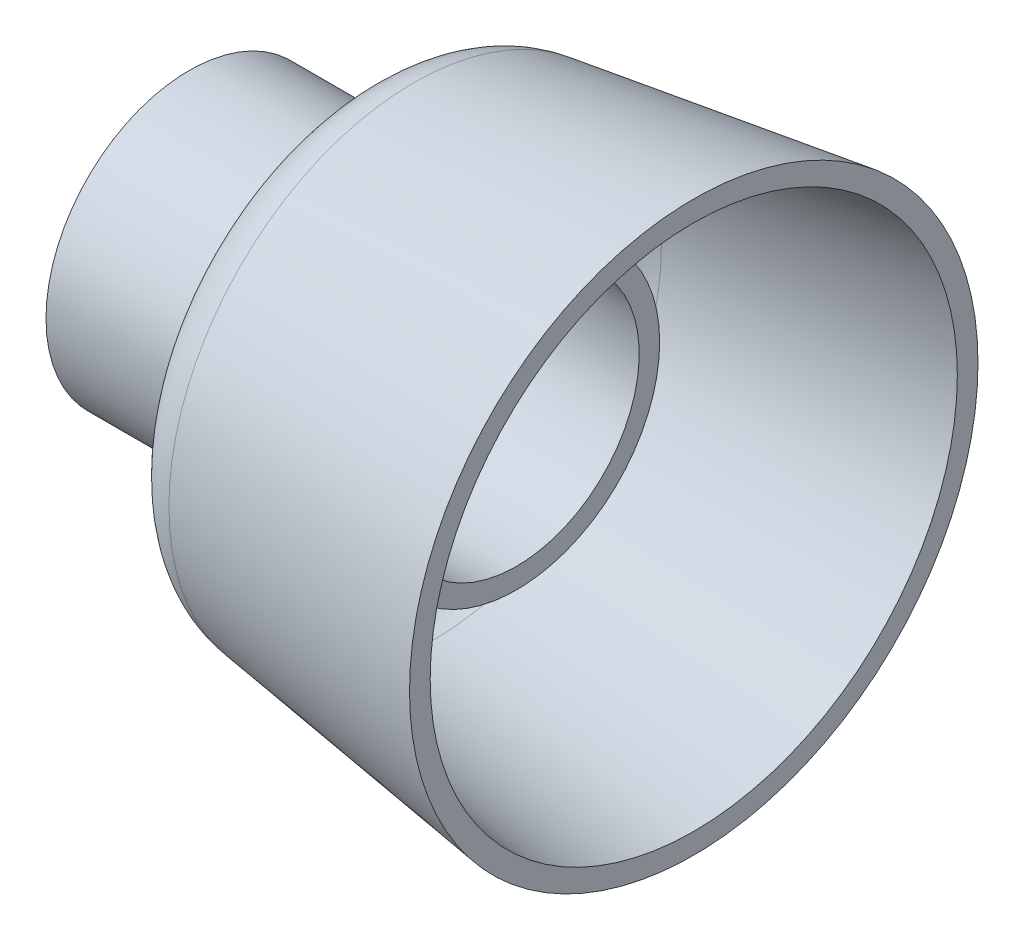
ISO-10303-21;
HEADER;
FILE_DESCRIPTION(('STEP AP214'),'2;1');
FILE_NAME('part.step','',(''),(''),'','','');
FILE_SCHEMA(('AUTOMOTIVE_DESIGN { 1 0 10303 214 1 1 1 1 }'));
ENDSEC;
DATA;
#1=APPLICATION_CONTEXT('core data for automotive mechanical design processes');
#2=APPLICATION_PROTOCOL_DEFINITION('international standard','automotive_design',2000,#1);
#3=PRODUCT_CONTEXT('',#1,'mechanical');
#4=PRODUCT('Part','Part','',(#3));
#5=PRODUCT_RELATED_PRODUCT_CATEGORY('part','',(#4));
#6=PRODUCT_DEFINITION_FORMATION('','',#4);
#7=PRODUCT_DEFINITION_CONTEXT('part definition',#1,'design');
#8=PRODUCT_DEFINITION('design','',#6,#7);
#9=PRODUCT_DEFINITION_SHAPE('','',#8);
#10=(LENGTH_UNIT() NAMED_UNIT(*) SI_UNIT(.MILLI.,.METRE.));
#11=(NAMED_UNIT(*) PLANE_ANGLE_UNIT() SI_UNIT($,.RADIAN.));
#12=(NAMED_UNIT(*) SI_UNIT($,.STERADIAN.) SOLID_ANGLE_UNIT());
#13=UNCERTAINTY_MEASURE_WITH_UNIT(LENGTH_MEASURE(1.E-05),#10,'distance_accuracy_value','');
#14=(GEOMETRIC_REPRESENTATION_CONTEXT(3) GLOBAL_UNCERTAINTY_ASSIGNED_CONTEXT((#13)) GLOBAL_UNIT_ASSIGNED_CONTEXT((#10,
#11,#12)) REPRESENTATION_CONTEXT('',''));
#15=CARTESIAN_POINT('',(0.,0.,0.));
#16=DIRECTION('',(0.,0.,1.));
#17=DIRECTION('',(1.,0.,0.));
#18=AXIS2_PLACEMENT_3D('',#15,#16,#17);
#19=CARTESIAN_POINT('',(0.,11.1125,0.));
#20=DIRECTION('',(1.,0.,0.));
#21=DIRECTION('',(0.,0.,-1.));
#22=AXIS2_PLACEMENT_3D('',#19,#20,#21);
#23=PLANE('',#22);
#24=CARTESIAN_POINT('',(0.,0.,0.));
#25=DIRECTION('',(-1.,0.,0.));
#26=DIRECTION('',(0.,0.,1.));
#27=AXIS2_PLACEMENT_3D('',#24,#25,#26);
#28=CIRCLE('',#27,9.525);
#29=CARTESIAN_POINT('',(0.,0.,9.525));
#30=VERTEX_POINT('',#29);
#31=EDGE_CURVE('E51',#30,#30,#28,.T.);
#32=ORIENTED_EDGE('',*,*,#31,.F.);
#33=EDGE_LOOP('',(#32));
#34=FACE_BOUND('',#33,.T.);
#35=CARTESIAN_POINT('',(0.,0.,0.));
#36=DIRECTION('',(-1.,0.,0.));
#37=DIRECTION('',(0.,0.,1.));
#38=AXIS2_PLACEMENT_3D('',#35,#36,#37);
#39=CIRCLE('',#38,11.1125);
#40=CARTESIAN_POINT('',(0.,0.,11.1125));
#41=VERTEX_POINT('',#40);
#42=EDGE_CURVE('E72',#41,#41,#39,.T.);
#43=ORIENTED_EDGE('',*,*,#42,.T.);
#44=EDGE_LOOP('',(#43));
#45=FACE_BOUND('',#44,.T.);
#46=ADVANCED_FACE('F31',(#34,#45),#23,.F.);
#47=CARTESIAN_POINT('',(0.,0.,0.));
#48=DIRECTION('',(-1.,0.,0.));
#49=DIRECTION('',(0.,0.,1.));
#50=AXIS2_PLACEMENT_3D('',#47,#48,#49);
#51=CYLINDRICAL_SURFACE('',#50,9.525);
#52=CARTESIAN_POINT('',(25.4,0.,0.));
#53=DIRECTION('',(-1.,0.,0.));
#54=DIRECTION('',(0.,0.,1.));
#55=AXIS2_PLACEMENT_3D('',#52,#53,#54);
#56=CIRCLE('',#55,9.525);
#57=CARTESIAN_POINT('',(25.4,0.,9.525));
#58=VERTEX_POINT('',#57);
#59=EDGE_CURVE('E54',#58,#58,#56,.T.);
#60=ORIENTED_EDGE('',*,*,#59,.F.);
#61=EDGE_LOOP('',(#60));
#62=FACE_BOUND('',#61,.T.);
#63=ORIENTED_EDGE('',*,*,#31,.T.);
#64=EDGE_LOOP('',(#63));
#65=FACE_BOUND('',#64,.T.);
#66=ADVANCED_FACE('F94',(#62,#65),#51,.F.);
#67=CARTESIAN_POINT('',(25.4,11.1125,0.));
#68=DIRECTION('',(-1.,0.,0.));
#69=DIRECTION('',(0.,0.,1.));
#70=AXIS2_PLACEMENT_3D('',#67,#68,#69);
#71=PLANE('',#70);
#72=CARTESIAN_POINT('',(25.4,0.,0.));
#73=DIRECTION('',(-1.,0.,0.));
#74=DIRECTION('',(0.,0.,1.));
#75=AXIS2_PLACEMENT_3D('',#72,#73,#74);
#76=CIRCLE('',#75,11.1125);
#77=CARTESIAN_POINT('',(25.4,0.,11.1125));
#78=VERTEX_POINT('',#77);
#79=EDGE_CURVE('E57',#78,#78,#76,.T.);
#80=ORIENTED_EDGE('',*,*,#79,.F.);
#81=EDGE_LOOP('',(#80));
#82=FACE_BOUND('',#81,.T.);
#83=ORIENTED_EDGE('',*,*,#59,.T.);
#84=EDGE_LOOP('',(#83));
#85=FACE_BOUND('',#84,.T.);
#86=ADVANCED_FACE('F100',(#82,#85),#71,.F.);
#87=CARTESIAN_POINT('',(0.,0.,0.));
#88=DIRECTION('',(-1.,0.,0.));
#89=DIRECTION('',(0.,0.,1.));
#90=AXIS2_PLACEMENT_3D('',#87,#88,#89);
#91=CYLINDRICAL_SURFACE('',#90,11.1125);
#92=CARTESIAN_POINT('',(14.5308299455354,0.,0.));
#93=DIRECTION('',(-1.,0.,0.));
#94=DIRECTION('',(0.,0.,1.));
#95=AXIS2_PLACEMENT_3D('',#92,#93,#94);
#96=CIRCLE('',#95,11.1125);
#97=CARTESIAN_POINT('',(14.5308299455354,0.,11.1125));
#98=VERTEX_POINT('',#97);
#99=EDGE_CURVE('E60',#98,#98,#96,.T.);
#100=ORIENTED_EDGE('',*,*,#99,.F.);
#101=EDGE_LOOP('',(#100));
#102=FACE_BOUND('',#101,.T.);
#103=ORIENTED_EDGE('',*,*,#79,.T.);
#104=EDGE_LOOP('',(#103));
#105=FACE_BOUND('',#104,.T.);
#106=ADVANCED_FACE('F131',(#102,#105),#91,.T.);
#107=CARTESIAN_POINT('',(14.5308299455354,0.,0.));
#108=DIRECTION('',(1.,0.,0.));
#109=DIRECTION('',(0.,0.,-1.));
#110=AXIS2_PLACEMENT_3D('',#107,#108,#109);
#111=CONICAL_SURFACE('',#110,11.1125,1.39626340159547);
#112=CARTESIAN_POINT('',(14.9936721884025,0.,0.));
#113=DIRECTION('',(1.,0.,0.));
#114=DIRECTION('',(0.,0.,-1.));
#115=AXIS2_PLACEMENT_3D('',#112,#113,#114);
#116=CIRCLE('',#115,13.7374087973234);
#117=CARTESIAN_POINT('',(14.9936721884025,0.,-13.7374087973234));
#118=VERTEX_POINT('',#117);
#119=EDGE_CURVE('E42',#118,#118,#116,.T.);
#120=ORIENTED_EDGE('',*,*,#119,.T.);
#121=EDGE_LOOP('',(#120));
#122=FACE_BOUND('',#121,.T.);
#123=ORIENTED_EDGE('',*,*,#99,.T.);
#124=EDGE_LOOP('',(#123));
#125=FACE_BOUND('',#124,.T.);
#126=ADVANCED_FACE('F118',(#122,#125),#111,.F.);
#127=CARTESIAN_POINT('',(15.5945224566591,0.,0.));
#128=DIRECTION('',(1.,0.,0.));
#129=DIRECTION('',(0.,0.,-1.));
#130=AXIS2_PLACEMENT_3D('',#127,#128,#129);
#131=CONICAL_SURFACE('',#130,17.145,0.139626340159547);
#132=CARTESIAN_POINT('',(19.0210072188008,0.,0.));
#133=DIRECTION('',(1.,0.,0.));
#134=DIRECTION('',(0.,0.,-1.));
#135=AXIS2_PLACEMENT_3D('',#132,#133,#134);
#136=CIRCLE('',#135,17.6265610285664);
#137=CARTESIAN_POINT('',(19.0210072188008,0.,-17.6265610285664));
#138=VERTEX_POINT('',#137);
#139=EDGE_CURVE('E46',#138,#138,#136,.F.);
#140=ORIENTED_EDGE('',*,*,#139,.T.);
#141=EDGE_LOOP('',(#140));
#142=FACE_BOUND('',#141,.T.);
#143=CARTESIAN_POINT('',(39.159831402695,0.,0.));
#144=DIRECTION('',(-1.,0.,0.));
#145=DIRECTION('',(0.,0.,1.));
#146=AXIS2_PLACEMENT_3D('',#143,#144,#145);
#147=CIRCLE('',#146,20.4568881892956);
#148=CARTESIAN_POINT('',(39.159831402695,0.,20.4568881892956));
#149=VERTEX_POINT('',#148);
#150=EDGE_CURVE('E63',#149,#149,#147,.T.);
#151=ORIENTED_EDGE('',*,*,#150,.F.);
#152=EDGE_LOOP('',(#151));
#153=FACE_BOUND('',#152,.T.);
#154=ADVANCED_FACE('F115',(#142,#153),#131,.F.);
#155=CARTESIAN_POINT('',(39.159831402695,22.0599894606689,0.));
#156=DIRECTION('',(-1.,0.,0.));
#157=DIRECTION('',(0.,0.,1.));
#158=AXIS2_PLACEMENT_3D('',#155,#156,#157);
#159=PLANE('',#158);
#160=CARTESIAN_POINT('',(39.159831402695,0.,0.));
#161=DIRECTION('',(-1.,0.,0.));
#162=DIRECTION('',(0.,0.,1.));
#163=AXIS2_PLACEMENT_3D('',#160,#161,#162);
#164=CIRCLE('',#163,22.0599894606689);
#165=CARTESIAN_POINT('',(39.159831402695,0.,22.0599894606689));
#166=VERTEX_POINT('',#165);
#167=EDGE_CURVE('E66',#166,#166,#164,.T.);
#168=ORIENTED_EDGE('',*,*,#167,.F.);
#169=EDGE_LOOP('',(#168));
#170=FACE_BOUND('',#169,.T.);
#171=ORIENTED_EDGE('',*,*,#150,.T.);
#172=EDGE_LOOP('',(#171));
#173=FACE_BOUND('',#172,.T.);
#174=ADVANCED_FACE('F91',(#170,#173),#159,.F.);
#175=CARTESIAN_POINT('',(39.159831402695,0.,0.));
#176=DIRECTION('',(1.,0.,0.));
#177=DIRECTION('',(0.,0.,-1.));
#178=AXIS2_PLACEMENT_3D('',#175,#176,#177);
#179=CONICAL_SURFACE('',#178,22.0599894606689,0.139626340159547);
#180=CARTESIAN_POINT('',(17.4335072188008,0.,0.));
#181=DIRECTION('',(-1.,0.,0.));
#182=DIRECTION('',(0.,0.,1.));
#183=AXIS2_PLACEMENT_3D('',#180,#181,#182);
#184=CIRCLE('',#183,19.0065537248497);
#185=CARTESIAN_POINT('',(17.4335072188008,0.,19.0065537248497));
#186=VERTEX_POINT('',#185);
#187=EDGE_CURVE('E10',#186,#186,#184,.F.);
#188=ORIENTED_EDGE('',*,*,#187,.T.);
#189=EDGE_LOOP('',(#188));
#190=FACE_BOUND('',#189,.T.);
#191=ORIENTED_EDGE('',*,*,#167,.T.);
#192=EDGE_LOOP('',(#191));
#193=FACE_BOUND('',#192,.T.);
#194=ADVANCED_FACE('F86',(#190,#193),#179,.T.);
#195=CARTESIAN_POINT('',(14.0070224566591,0.,0.));
#196=DIRECTION('',(1.,0.,0.));
#197=DIRECTION('',(0.,0.,-1.));
#198=AXIS2_PLACEMENT_3D('',#195,#196,#197);
#199=CONICAL_SURFACE('',#198,18.5249926962833,1.39626340159547);
#200=CARTESIAN_POINT('',(13.4061721884025,0.,0.));
#201=DIRECTION('',(-1.,0.,0.));
#202=DIRECTION('',(0.,0.,1.));
#203=AXIS2_PLACEMENT_3D('',#200,#201,#202);
#204=CIRCLE('',#203,15.1174014936067);
#205=CARTESIAN_POINT('',(13.4061721884025,0.,15.1174014936067));
#206=VERTEX_POINT('',#205);
#207=EDGE_CURVE('E38',#206,#206,#204,.T.);
#208=ORIENTED_EDGE('',*,*,#207,.T.);
#209=EDGE_LOOP('',(#208));
#210=FACE_BOUND('',#209,.T.);
#211=CARTESIAN_POINT('',(12.7,0.,0.));
#212=DIRECTION('',(-1.,0.,0.));
#213=DIRECTION('',(0.,0.,1.));
#214=AXIS2_PLACEMENT_3D('',#211,#212,#213);
#215=CIRCLE('',#214,11.1125);
#216=CARTESIAN_POINT('',(12.7,0.,11.1125));
#217=VERTEX_POINT('',#216);
#218=EDGE_CURVE('E69',#217,#217,#215,.T.);
#219=ORIENTED_EDGE('',*,*,#218,.F.);
#220=EDGE_LOOP('',(#219));
#221=FACE_BOUND('',#220,.T.);
#222=ADVANCED_FACE('F81',(#210,#221),#199,.T.);
#223=CARTESIAN_POINT('',(0.,0.,0.));
#224=DIRECTION('',(-1.,0.,0.));
#225=DIRECTION('',(0.,0.,1.));
#226=AXIS2_PLACEMENT_3D('',#223,#224,#225);
#227=CYLINDRICAL_SURFACE('',#226,11.1125);
#228=ORIENTED_EDGE('',*,*,#42,.F.);
#229=EDGE_LOOP('',(#228));
#230=FACE_BOUND('',#229,.T.);
#231=ORIENTED_EDGE('',*,*,#218,.T.);
#232=EDGE_LOOP('',(#231));
#233=FACE_BOUND('',#232,.T.);
#234=ADVANCED_FACE('F77',(#230,#233),#227,.T.);
#235=CARTESIAN_POINT('',(19.6838191121231,0.,0.));
#236=DIRECTION('',(-1.,0.,0.));
#237=DIRECTION('',(0.,0.,1.));
#238=AXIS2_PLACEMENT_3D('',#235,#236,#237);
#239=TOROIDAL_SURFACE('',#238,12.9104093511847,4.7625);
#240=ORIENTED_EDGE('',*,*,#119,.F.);
#241=EDGE_LOOP('',(#240));
#242=FACE_BOUND('',#241,.T.);
#243=ORIENTED_EDGE('',*,*,#139,.F.);
#244=EDGE_LOOP('',(#243));
#245=FACE_BOUND('',#244,.T.);
#246=ADVANCED_FACE('F80',(#242,#245),#239,.F.);
#247=CARTESIAN_POINT('',(18.0963191121231,0.,0.));
#248=DIRECTION('',(1.,0.,0.));
#249=DIRECTION('',(0.,0.,-1.));
#250=AXIS2_PLACEMENT_3D('',#247,#248,#249);
#251=TOROIDAL_SURFACE('',#250,14.2904020474679,4.7625);
#252=ORIENTED_EDGE('',*,*,#187,.F.);
#253=EDGE_LOOP('',(#252));
#254=FACE_BOUND('',#253,.T.);
#255=ORIENTED_EDGE('',*,*,#207,.F.);
#256=EDGE_LOOP('',(#255));
#257=FACE_BOUND('',#256,.T.);
#258=ADVANCED_FACE('F33',(#254,#257),#251,.T.);
#259=CLOSED_SHELL('',(#46,#66,#86,#106,#126,#154,#174,#194,#222,#234,#246,#258));
#260=MANIFOLD_SOLID_BREP('B2',#259);
#261=ADVANCED_BREP_SHAPE_REPRESENTATION('',(#18,#260),#14);
#262=SHAPE_DEFINITION_REPRESENTATION(#9,#261);
ENDSEC;
END-ISO-10303-21;
